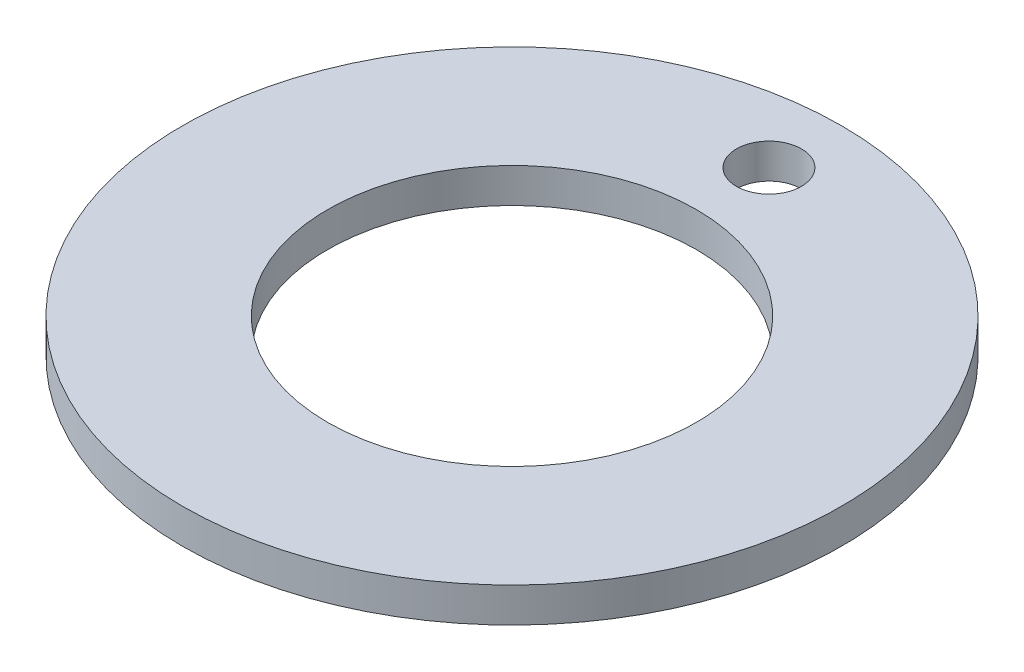
ISO-10303-21;
HEADER;
FILE_DESCRIPTION(('STEP AP214'),'2;1');
FILE_NAME('part.step','',(''),(''),'','','');
FILE_SCHEMA(('AUTOMOTIVE_DESIGN { 1 0 10303 214 1 1 1 1 }'));
ENDSEC;
DATA;
#1=APPLICATION_CONTEXT('core data for automotive mechanical design processes');
#2=APPLICATION_PROTOCOL_DEFINITION('international standard','automotive_design',2000,#1);
#3=PRODUCT_CONTEXT('',#1,'mechanical');
#4=PRODUCT('Part','Part','',(#3));
#5=PRODUCT_RELATED_PRODUCT_CATEGORY('part','',(#4));
#6=PRODUCT_DEFINITION_FORMATION('','',#4);
#7=PRODUCT_DEFINITION_CONTEXT('part definition',#1,'design');
#8=PRODUCT_DEFINITION('design','',#6,#7);
#9=PRODUCT_DEFINITION_SHAPE('','',#8);
#10=(LENGTH_UNIT() NAMED_UNIT(*) SI_UNIT(.MILLI.,.METRE.));
#11=(NAMED_UNIT(*) PLANE_ANGLE_UNIT() SI_UNIT($,.RADIAN.));
#12=(NAMED_UNIT(*) SI_UNIT($,.STERADIAN.) SOLID_ANGLE_UNIT());
#13=UNCERTAINTY_MEASURE_WITH_UNIT(LENGTH_MEASURE(1.E-05),#10,'distance_accuracy_value','');
#14=(GEOMETRIC_REPRESENTATION_CONTEXT(3) GLOBAL_UNCERTAINTY_ASSIGNED_CONTEXT((#13)) GLOBAL_UNIT_ASSIGNED_CONTEXT((#10,
#11,#12)) REPRESENTATION_CONTEXT('',''));
#15=CARTESIAN_POINT('',(0.,0.,0.));
#16=DIRECTION('',(0.,0.,1.));
#17=DIRECTION('',(1.,0.,0.));
#18=AXIS2_PLACEMENT_3D('',#15,#16,#17);
#19=CARTESIAN_POINT('',(0.,5.08,0.));
#20=DIRECTION('',(0.,1.,0.));
#21=DIRECTION('',(0.,0.,1.));
#22=AXIS2_PLACEMENT_3D('',#19,#20,#21);
#23=PLANE('',#22);
#24=CARTESIAN_POINT('',(0.,5.08,0.));
#25=DIRECTION('',(0.,1.,0.));
#26=DIRECTION('',(0.,0.,1.));
#27=AXIS2_PLACEMENT_3D('',#24,#25,#26);
#28=CIRCLE('',#27,27.);
#29=CARTESIAN_POINT('',(0.,5.08,27.));
#30=VERTEX_POINT('',#29);
#31=EDGE_CURVE('E50',#30,#30,#28,.T.);
#32=ORIENTED_EDGE('',*,*,#31,.F.);
#33=EDGE_LOOP('',(#32));
#34=FACE_BOUND('',#33,.T.);
#35=CARTESIAN_POINT('',(0.,5.08,0.));
#36=DIRECTION('',(0.,1.,0.));
#37=DIRECTION('',(0.,0.,1.));
#38=AXIS2_PLACEMENT_3D('',#35,#36,#37);
#39=CIRCLE('',#38,48.26);
#40=CARTESIAN_POINT('',(0.,5.08,48.26));
#41=VERTEX_POINT('',#40);
#42=EDGE_CURVE('E10',#41,#41,#39,.T.);
#43=ORIENTED_EDGE('',*,*,#42,.T.);
#44=EDGE_LOOP('',(#43));
#45=FACE_BOUND('',#44,.T.);
#46=CARTESIAN_POINT('',(0.,5.08,-37.63));
#47=DIRECTION('',(0.,1.,0.));
#48=DIRECTION('',(0.,0.,1.));
#49=AXIS2_PLACEMENT_3D('',#46,#47,#48);
#50=CIRCLE('',#49,4.7625);
#51=CARTESIAN_POINT('',(0.,5.08,-32.8675));
#52=VERTEX_POINT('',#51);
#53=EDGE_CURVE('E56',#52,#52,#50,.T.);
#54=ORIENTED_EDGE('',*,*,#53,.F.);
#55=EDGE_LOOP('',(#54));
#56=FACE_BOUND('',#55,.T.);
#57=ADVANCED_FACE('F37',(#34,#45,#56),#23,.T.);
#58=CARTESIAN_POINT('',(0.,0.,0.));
#59=DIRECTION('',(0.,1.,0.));
#60=DIRECTION('',(0.,0.,1.));
#61=AXIS2_PLACEMENT_3D('',#58,#59,#60);
#62=PLANE('',#61);
#63=CARTESIAN_POINT('',(0.,0.,0.));
#64=DIRECTION('',(0.,1.,0.));
#65=DIRECTION('',(0.,0.,1.));
#66=AXIS2_PLACEMENT_3D('',#63,#64,#65);
#67=CIRCLE('',#66,48.26);
#68=CARTESIAN_POINT('',(0.,0.,48.26));
#69=VERTEX_POINT('',#68);
#70=EDGE_CURVE('E41',#69,#69,#67,.T.);
#71=ORIENTED_EDGE('',*,*,#70,.F.);
#72=EDGE_LOOP('',(#71));
#73=FACE_BOUND('',#72,.T.);
#74=CARTESIAN_POINT('',(0.,0.,0.));
#75=DIRECTION('',(0.,1.,0.));
#76=DIRECTION('',(0.,0.,1.));
#77=AXIS2_PLACEMENT_3D('',#74,#75,#76);
#78=CIRCLE('',#77,27.);
#79=CARTESIAN_POINT('',(0.,0.,27.));
#80=VERTEX_POINT('',#79);
#81=EDGE_CURVE('E52',#80,#80,#78,.T.);
#82=ORIENTED_EDGE('',*,*,#81,.T.);
#83=EDGE_LOOP('',(#82));
#84=FACE_BOUND('',#83,.T.);
#85=CARTESIAN_POINT('',(0.,0.,-37.63));
#86=DIRECTION('',(0.,1.,0.));
#87=DIRECTION('',(0.,0.,1.));
#88=AXIS2_PLACEMENT_3D('',#85,#86,#87);
#89=CIRCLE('',#88,4.7625);
#90=CARTESIAN_POINT('',(0.,0.,-32.8675));
#91=VERTEX_POINT('',#90);
#92=EDGE_CURVE('E60',#91,#91,#89,.T.);
#93=ORIENTED_EDGE('',*,*,#92,.T.);
#94=EDGE_LOOP('',(#93));
#95=FACE_BOUND('',#94,.T.);
#96=ADVANCED_FACE('F72',(#73,#84,#95),#62,.F.);
#97=CARTESIAN_POINT('',(0.,5.08,0.));
#98=DIRECTION('',(0.,-1.,0.));
#99=DIRECTION('',(0.,0.,-1.));
#100=AXIS2_PLACEMENT_3D('',#97,#98,#99);
#101=CYLINDRICAL_SURFACE('',#100,48.26);
#102=ORIENTED_EDGE('',*,*,#42,.F.);
#103=EDGE_LOOP('',(#102));
#104=FACE_BOUND('',#103,.T.);
#105=ORIENTED_EDGE('',*,*,#70,.T.);
#106=EDGE_LOOP('',(#105));
#107=FACE_BOUND('',#106,.T.);
#108=ADVANCED_FACE('F39',(#104,#107),#101,.T.);
#109=CARTESIAN_POINT('',(0.,5.08,0.));
#110=DIRECTION('',(0.,-1.,0.));
#111=DIRECTION('',(0.,0.,-1.));
#112=AXIS2_PLACEMENT_3D('',#109,#110,#111);
#113=CYLINDRICAL_SURFACE('',#112,27.);
#114=ORIENTED_EDGE('',*,*,#31,.T.);
#115=EDGE_LOOP('',(#114));
#116=FACE_BOUND('',#115,.T.);
#117=ORIENTED_EDGE('',*,*,#81,.F.);
#118=EDGE_LOOP('',(#117));
#119=FACE_BOUND('',#118,.T.);
#120=ADVANCED_FACE('F81',(#116,#119),#113,.F.);
#121=CARTESIAN_POINT('',(0.,5.08,-37.63));
#122=DIRECTION('',(0.,-1.,0.));
#123=DIRECTION('',(0.,0.,-1.));
#124=AXIS2_PLACEMENT_3D('',#121,#122,#123);
#125=CYLINDRICAL_SURFACE('',#124,4.7625);
#126=ORIENTED_EDGE('',*,*,#53,.T.);
#127=EDGE_LOOP('',(#126));
#128=FACE_BOUND('',#127,.T.);
#129=ORIENTED_EDGE('',*,*,#92,.F.);
#130=EDGE_LOOP('',(#129));
#131=FACE_BOUND('',#130,.T.);
#132=ADVANCED_FACE('F68',(#128,#131),#125,.F.);
#133=CLOSED_SHELL('',(#57,#96,#108,#120,#132));
#134=MANIFOLD_SOLID_BREP('B2',#133);
#135=ADVANCED_BREP_SHAPE_REPRESENTATION('',(#18,#134),#14);
#136=SHAPE_DEFINITION_REPRESENTATION(#9,#135);
ENDSEC;
END-ISO-10303-21;
